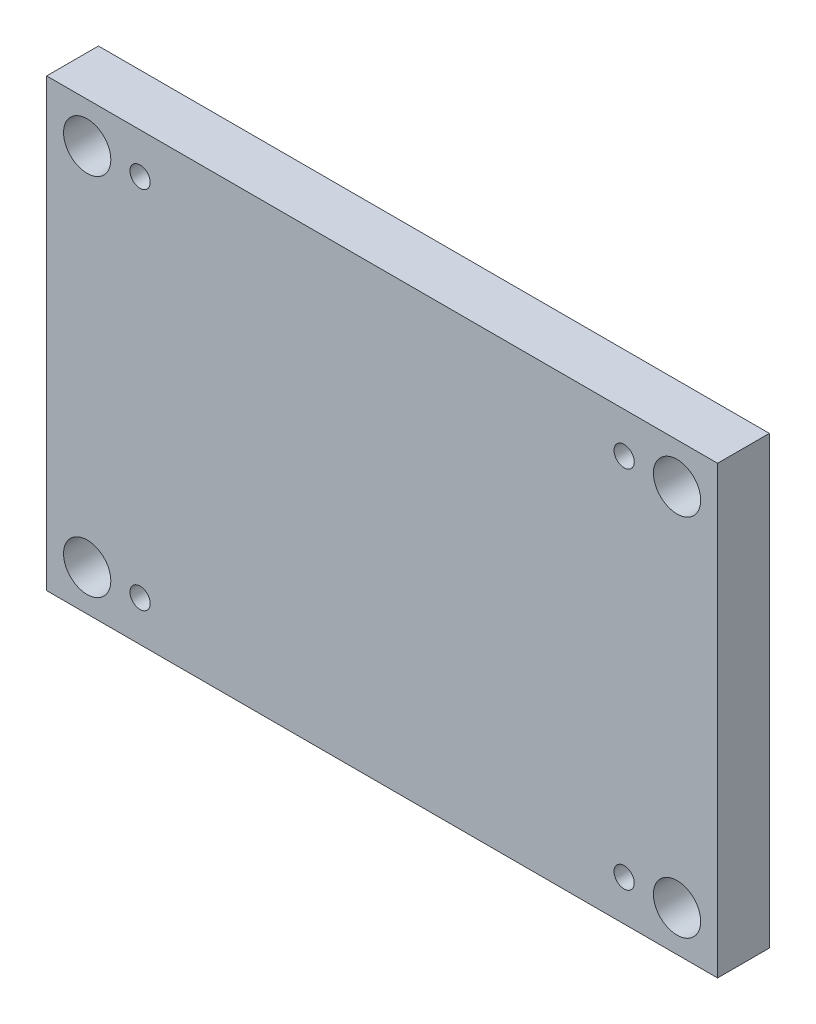
ISO-10303-21;
HEADER;
FILE_DESCRIPTION(('STEP AP214'),'2;1');
FILE_NAME('part.step','',(''),(''),'','','');
FILE_SCHEMA(('AUTOMOTIVE_DESIGN { 1 0 10303 214 1 1 1 1 }'));
ENDSEC;
DATA;
#1=APPLICATION_CONTEXT('core data for automotive mechanical design processes');
#2=APPLICATION_PROTOCOL_DEFINITION('international standard','automotive_design',2000,#1);
#3=PRODUCT_CONTEXT('',#1,'mechanical');
#4=PRODUCT('Part','Part','',(#3));
#5=PRODUCT_RELATED_PRODUCT_CATEGORY('part','',(#4));
#6=PRODUCT_DEFINITION_FORMATION('','',#4);
#7=PRODUCT_DEFINITION_CONTEXT('part definition',#1,'design');
#8=PRODUCT_DEFINITION('design','',#6,#7);
#9=PRODUCT_DEFINITION_SHAPE('','',#8);
#10=(LENGTH_UNIT() NAMED_UNIT(*) SI_UNIT(.MILLI.,.METRE.));
#11=(NAMED_UNIT(*) PLANE_ANGLE_UNIT() SI_UNIT($,.RADIAN.));
#12=(NAMED_UNIT(*) SI_UNIT($,.STERADIAN.) SOLID_ANGLE_UNIT());
#13=UNCERTAINTY_MEASURE_WITH_UNIT(LENGTH_MEASURE(1.E-05),#10,'distance_accuracy_value','');
#14=(GEOMETRIC_REPRESENTATION_CONTEXT(3) GLOBAL_UNCERTAINTY_ASSIGNED_CONTEXT((#13)) GLOBAL_UNIT_ASSIGNED_CONTEXT((#10,
#11,#12)) REPRESENTATION_CONTEXT('',''));
#15=CARTESIAN_POINT('',(0.,0.,0.));
#16=DIRECTION('',(0.,0.,1.));
#17=DIRECTION('',(1.,0.,0.));
#18=AXIS2_PLACEMENT_3D('',#15,#16,#17);
#19=CARTESIAN_POINT('',(0.,0.,46.));
#20=DIRECTION('',(0.,0.,1.));
#21=DIRECTION('',(1.,0.,0.));
#22=AXIS2_PLACEMENT_3D('',#19,#20,#21);
#23=PLANE('',#22);
#24=CARTESIAN_POINT('',(-215.,162.,46.));
#25=DIRECTION('',(0.,0.,1.));
#26=DIRECTION('',(1.,0.,0.));
#27=AXIS2_PLACEMENT_3D('',#24,#25,#26);
#28=CIRCLE('',#27,9.00000000000001);
#29=CARTESIAN_POINT('',(-206.,162.,46.));
#30=VERTEX_POINT('',#29);
#31=EDGE_CURVE('E149',#30,#30,#28,.T.);
#32=ORIENTED_EDGE('',*,*,#31,.F.);
#33=EDGE_LOOP('',(#32));
#34=FACE_BOUND('',#33,.T.);
#35=CARTESIAN_POINT('',(215.,162.,46.));
#36=DIRECTION('',(0.,0.,1.));
#37=DIRECTION('',(1.,0.,0.));
#38=AXIS2_PLACEMENT_3D('',#35,#36,#37);
#39=CIRCLE('',#38,9.00000000000001);
#40=CARTESIAN_POINT('',(224.,162.,46.));
#41=VERTEX_POINT('',#40);
#42=EDGE_CURVE('E135',#41,#41,#39,.T.);
#43=ORIENTED_EDGE('',*,*,#42,.F.);
#44=EDGE_LOOP('',(#43));
#45=FACE_BOUND('',#44,.T.);
#46=CARTESIAN_POINT('',(-262.,162.,46.));
#47=DIRECTION('',(0.,0.,1.));
#48=DIRECTION('',(1.,0.,0.));
#49=AXIS2_PLACEMENT_3D('',#46,#47,#48);
#50=CIRCLE('',#49,21.);
#51=CARTESIAN_POINT('',(-241.,162.,46.));
#52=VERTEX_POINT('',#51);
#53=EDGE_CURVE('E132',#52,#52,#50,.T.);
#54=ORIENTED_EDGE('',*,*,#53,.F.);
#55=EDGE_LOOP('',(#54));
#56=FACE_BOUND('',#55,.T.);
#57=CARTESIAN_POINT('',(-262.,-162.,46.));
#58=DIRECTION('',(0.,0.,1.));
#59=DIRECTION('',(1.,0.,0.));
#60=AXIS2_PLACEMENT_3D('',#57,#58,#59);
#61=CIRCLE('',#60,21.);
#62=CARTESIAN_POINT('',(-241.,-162.,46.));
#63=VERTEX_POINT('',#62);
#64=EDGE_CURVE('E126',#63,#63,#61,.T.);
#65=ORIENTED_EDGE('',*,*,#64,.F.);
#66=EDGE_LOOP('',(#65));
#67=FACE_BOUND('',#66,.T.);
#68=CARTESIAN_POINT('',(262.,-162.,46.));
#69=DIRECTION('',(0.,0.,1.));
#70=DIRECTION('',(1.,0.,0.));
#71=AXIS2_PLACEMENT_3D('',#68,#69,#70);
#72=CIRCLE('',#71,21.);
#73=CARTESIAN_POINT('',(283.,-162.,46.));
#74=VERTEX_POINT('',#73);
#75=EDGE_CURVE('E120',#74,#74,#72,.T.);
#76=ORIENTED_EDGE('',*,*,#75,.F.);
#77=EDGE_LOOP('',(#76));
#78=FACE_BOUND('',#77,.T.);
#79=CARTESIAN_POINT('',(262.,162.,46.));
#80=DIRECTION('',(0.,0.,1.));
#81=DIRECTION('',(1.,0.,0.));
#82=AXIS2_PLACEMENT_3D('',#79,#80,#81);
#83=CIRCLE('',#82,21.);
#84=CARTESIAN_POINT('',(283.,162.,46.));
#85=VERTEX_POINT('',#84);
#86=EDGE_CURVE('E114',#85,#85,#83,.T.);
#87=ORIENTED_EDGE('',*,*,#86,.F.);
#88=EDGE_LOOP('',(#87));
#89=FACE_BOUND('',#88,.T.);
#90=DIRECTION('',(0.,-1.,0.));
#91=VECTOR('',#90,1.);
#92=CARTESIAN_POINT('',(-298.,198.,46.));
#93=LINE('',#92,#91);
#94=CARTESIAN_POINT('',(-298.,198.,46.));
#95=VERTEX_POINT('',#94);
#96=CARTESIAN_POINT('',(-298.,-198.,46.));
#97=VERTEX_POINT('',#96);
#98=EDGE_CURVE('E87',#95,#97,#93,.T.);
#99=ORIENTED_EDGE('',*,*,#98,.T.);
#100=DIRECTION('',(1.,0.,0.));
#101=VECTOR('',#100,1.);
#102=CARTESIAN_POINT('',(-298.,-198.,46.));
#103=LINE('',#102,#101);
#104=CARTESIAN_POINT('',(298.,-198.,46.));
#105=VERTEX_POINT('',#104);
#106=EDGE_CURVE('E82',#97,#105,#103,.T.);
#107=ORIENTED_EDGE('',*,*,#106,.T.);
#108=DIRECTION('',(0.,1.,0.));
#109=VECTOR('',#108,1.);
#110=CARTESIAN_POINT('',(298.,-198.,46.));
#111=LINE('',#110,#109);
#112=CARTESIAN_POINT('',(298.,198.,46.));
#113=VERTEX_POINT('',#112);
#114=EDGE_CURVE('E85',#105,#113,#111,.T.);
#115=ORIENTED_EDGE('',*,*,#114,.T.);
#116=DIRECTION('',(-1.,0.,0.));
#117=VECTOR('',#116,1.);
#118=CARTESIAN_POINT('',(298.,198.,46.));
#119=LINE('',#118,#117);
#120=EDGE_CURVE('E52',#113,#95,#119,.T.);
#121=ORIENTED_EDGE('',*,*,#120,.T.);
#122=EDGE_LOOP('',(#99,#107,#115,#121));
#123=FACE_BOUND('',#122,.T.);
#124=CARTESIAN_POINT('',(215.,-162.,46.));
#125=DIRECTION('',(0.,0.,-1.));
#126=DIRECTION('',(-1.,0.,0.));
#127=AXIS2_PLACEMENT_3D('',#124,#125,#126);
#128=CIRCLE('',#127,9.00000000000001);
#129=CARTESIAN_POINT('',(206.,-162.,46.));
#130=VERTEX_POINT('',#129);
#131=EDGE_CURVE('E146',#130,#130,#128,.T.);
#132=ORIENTED_EDGE('',*,*,#131,.T.);
#133=EDGE_LOOP('',(#132));
#134=FACE_BOUND('',#133,.T.);
#135=CARTESIAN_POINT('',(-215.,-162.,46.));
#136=DIRECTION('',(0.,0.,-1.));
#137=DIRECTION('',(-1.,0.,0.));
#138=AXIS2_PLACEMENT_3D('',#135,#136,#137);
#139=CIRCLE('',#138,9.00000000000001);
#140=CARTESIAN_POINT('',(-224.,-162.,46.));
#141=VERTEX_POINT('',#140);
#142=EDGE_CURVE('E158',#141,#141,#139,.T.);
#143=ORIENTED_EDGE('',*,*,#142,.T.);
#144=EDGE_LOOP('',(#143));
#145=FACE_BOUND('',#144,.T.);
#146=ADVANCED_FACE('F35',(#34,#45,#56,#67,#78,#89,#123,#134,#145),#23,.T.);
#147=CARTESIAN_POINT('',(0.,0.,0.));
#148=DIRECTION('',(0.,0.,1.));
#149=DIRECTION('',(1.,0.,0.));
#150=AXIS2_PLACEMENT_3D('',#147,#148,#149);
#151=PLANE('',#150);
#152=CARTESIAN_POINT('',(-215.,162.,0.));
#153=DIRECTION('',(0.,0.,1.));
#154=DIRECTION('',(1.,0.,0.));
#155=AXIS2_PLACEMENT_3D('',#152,#153,#154);
#156=CIRCLE('',#155,9.00000000000001);
#157=CARTESIAN_POINT('',(-206.,162.,0.));
#158=VERTEX_POINT('',#157);
#159=EDGE_CURVE('E152',#158,#158,#156,.T.);
#160=ORIENTED_EDGE('',*,*,#159,.T.);
#161=EDGE_LOOP('',(#160));
#162=FACE_BOUND('',#161,.T.);
#163=CARTESIAN_POINT('',(215.,162.,0.));
#164=DIRECTION('',(0.,0.,1.));
#165=DIRECTION('',(1.,0.,0.));
#166=AXIS2_PLACEMENT_3D('',#163,#164,#165);
#167=CIRCLE('',#166,9.00000000000001);
#168=CARTESIAN_POINT('',(224.,162.,0.));
#169=VERTEX_POINT('',#168);
#170=EDGE_CURVE('E140',#169,#169,#167,.T.);
#171=ORIENTED_EDGE('',*,*,#170,.T.);
#172=EDGE_LOOP('',(#171));
#173=FACE_BOUND('',#172,.T.);
#174=CARTESIAN_POINT('',(-262.,162.,0.));
#175=DIRECTION('',(0.,0.,1.));
#176=DIRECTION('',(1.,0.,0.));
#177=AXIS2_PLACEMENT_3D('',#174,#175,#176);
#178=CIRCLE('',#177,21.);
#179=CARTESIAN_POINT('',(-241.,162.,0.));
#180=VERTEX_POINT('',#179);
#181=EDGE_CURVE('E129',#180,#180,#178,.T.);
#182=ORIENTED_EDGE('',*,*,#181,.T.);
#183=EDGE_LOOP('',(#182));
#184=FACE_BOUND('',#183,.T.);
#185=CARTESIAN_POINT('',(-262.,-162.,0.));
#186=DIRECTION('',(0.,0.,1.));
#187=DIRECTION('',(1.,0.,0.));
#188=AXIS2_PLACEMENT_3D('',#185,#186,#187);
#189=CIRCLE('',#188,21.);
#190=CARTESIAN_POINT('',(-241.,-162.,0.));
#191=VERTEX_POINT('',#190);
#192=EDGE_CURVE('E123',#191,#191,#189,.T.);
#193=ORIENTED_EDGE('',*,*,#192,.T.);
#194=EDGE_LOOP('',(#193));
#195=FACE_BOUND('',#194,.T.);
#196=CARTESIAN_POINT('',(262.,-162.,0.));
#197=DIRECTION('',(0.,0.,1.));
#198=DIRECTION('',(1.,0.,0.));
#199=AXIS2_PLACEMENT_3D('',#196,#197,#198);
#200=CIRCLE('',#199,21.);
#201=CARTESIAN_POINT('',(283.,-162.,0.));
#202=VERTEX_POINT('',#201);
#203=EDGE_CURVE('E117',#202,#202,#200,.T.);
#204=ORIENTED_EDGE('',*,*,#203,.T.);
#205=EDGE_LOOP('',(#204));
#206=FACE_BOUND('',#205,.T.);
#207=CARTESIAN_POINT('',(262.,162.,0.));
#208=DIRECTION('',(0.,0.,1.));
#209=DIRECTION('',(1.,0.,0.));
#210=AXIS2_PLACEMENT_3D('',#207,#208,#209);
#211=CIRCLE('',#210,21.);
#212=CARTESIAN_POINT('',(283.,162.,0.));
#213=VERTEX_POINT('',#212);
#214=EDGE_CURVE('E102',#213,#213,#211,.T.);
#215=ORIENTED_EDGE('',*,*,#214,.T.);
#216=EDGE_LOOP('',(#215));
#217=FACE_BOUND('',#216,.T.);
#218=DIRECTION('',(0.,-1.,0.));
#219=VECTOR('',#218,1.);
#220=CARTESIAN_POINT('',(-298.,198.,0.));
#221=LINE('',#220,#219);
#222=CARTESIAN_POINT('',(-298.,198.,0.));
#223=VERTEX_POINT('',#222);
#224=CARTESIAN_POINT('',(-298.,-198.,0.));
#225=VERTEX_POINT('',#224);
#226=EDGE_CURVE('E99',#223,#225,#221,.T.);
#227=ORIENTED_EDGE('',*,*,#226,.F.);
#228=DIRECTION('',(-1.,0.,0.));
#229=VECTOR('',#228,1.);
#230=CARTESIAN_POINT('',(298.,198.,0.));
#231=LINE('',#230,#229);
#232=CARTESIAN_POINT('',(298.,198.,0.));
#233=VERTEX_POINT('',#232);
#234=EDGE_CURVE('E75',#233,#223,#231,.T.);
#235=ORIENTED_EDGE('',*,*,#234,.F.);
#236=DIRECTION('',(0.,1.,0.));
#237=VECTOR('',#236,1.);
#238=CARTESIAN_POINT('',(298.,-198.,0.));
#239=LINE('',#238,#237);
#240=CARTESIAN_POINT('',(298.,-198.,0.));
#241=VERTEX_POINT('',#240);
#242=EDGE_CURVE('E69',#241,#233,#239,.T.);
#243=ORIENTED_EDGE('',*,*,#242,.F.);
#244=DIRECTION('',(1.,0.,0.));
#245=VECTOR('',#244,1.);
#246=CARTESIAN_POINT('',(-298.,-198.,0.));
#247=LINE('',#246,#245);
#248=EDGE_CURVE('E91',#225,#241,#247,.T.);
#249=ORIENTED_EDGE('',*,*,#248,.F.);
#250=EDGE_LOOP('',(#227,#235,#243,#249));
#251=FACE_BOUND('',#250,.T.);
#252=CARTESIAN_POINT('',(215.,-162.,0.));
#253=DIRECTION('',(0.,0.,-1.));
#254=DIRECTION('',(-1.,0.,0.));
#255=AXIS2_PLACEMENT_3D('',#252,#253,#254);
#256=CIRCLE('',#255,9.00000000000001);
#257=CARTESIAN_POINT('',(206.,-162.,0.));
#258=VERTEX_POINT('',#257);
#259=EDGE_CURVE('E143',#258,#258,#256,.T.);
#260=ORIENTED_EDGE('',*,*,#259,.F.);
#261=EDGE_LOOP('',(#260));
#262=FACE_BOUND('',#261,.T.);
#263=CARTESIAN_POINT('',(-215.,-162.,0.));
#264=DIRECTION('',(0.,0.,-1.));
#265=DIRECTION('',(-1.,0.,0.));
#266=AXIS2_PLACEMENT_3D('',#263,#264,#265);
#267=CIRCLE('',#266,9.00000000000001);
#268=CARTESIAN_POINT('',(-224.,-162.,0.));
#269=VERTEX_POINT('',#268);
#270=EDGE_CURVE('E155',#269,#269,#267,.T.);
#271=ORIENTED_EDGE('',*,*,#270,.F.);
#272=EDGE_LOOP('',(#271));
#273=FACE_BOUND('',#272,.T.);
#274=ADVANCED_FACE('F110',(#162,#173,#184,#195,#206,#217,#251,#262,#273),#151,.F.);
#275=CARTESIAN_POINT('',(-298.,198.,46.));
#276=DIRECTION('',(1.,0.,0.));
#277=DIRECTION('',(0.,0.,-1.));
#278=AXIS2_PLACEMENT_3D('',#275,#276,#277);
#279=PLANE('',#278);
#280=ORIENTED_EDGE('',*,*,#226,.T.);
#281=DIRECTION('',(0.,0.,-1.));
#282=VECTOR('',#281,1.);
#283=CARTESIAN_POINT('',(-298.,-198.,46.));
#284=LINE('',#283,#282);
#285=EDGE_CURVE('E11',#97,#225,#284,.T.);
#286=ORIENTED_EDGE('',*,*,#285,.F.);
#287=ORIENTED_EDGE('',*,*,#98,.F.);
#288=DIRECTION('',(0.,0.,-1.));
#289=VECTOR('',#288,1.);
#290=CARTESIAN_POINT('',(-298.,198.,46.));
#291=LINE('',#290,#289);
#292=EDGE_CURVE('E95',#95,#223,#291,.T.);
#293=ORIENTED_EDGE('',*,*,#292,.T.);
#294=EDGE_LOOP('',(#280,#286,#287,#293));
#295=FACE_BOUND('',#294,.T.);
#296=ADVANCED_FACE('F37',(#295),#279,.F.);
#297=CARTESIAN_POINT('',(-298.,-198.,46.));
#298=DIRECTION('',(0.,1.,0.));
#299=DIRECTION('',(0.,0.,1.));
#300=AXIS2_PLACEMENT_3D('',#297,#298,#299);
#301=PLANE('',#300);
#302=ORIENTED_EDGE('',*,*,#248,.T.);
#303=DIRECTION('',(0.,0.,-1.));
#304=VECTOR('',#303,1.);
#305=CARTESIAN_POINT('',(298.,-198.,46.));
#306=LINE('',#305,#304);
#307=EDGE_CURVE('E44',#105,#241,#306,.T.);
#308=ORIENTED_EDGE('',*,*,#307,.F.);
#309=ORIENTED_EDGE('',*,*,#106,.F.);
#310=ORIENTED_EDGE('',*,*,#285,.T.);
#311=EDGE_LOOP('',(#302,#308,#309,#310));
#312=FACE_BOUND('',#311,.T.);
#313=ADVANCED_FACE('F90',(#312),#301,.F.);
#314=CARTESIAN_POINT('',(298.,-198.,46.));
#315=DIRECTION('',(-1.,0.,0.));
#316=DIRECTION('',(0.,0.,1.));
#317=AXIS2_PLACEMENT_3D('',#314,#315,#316);
#318=PLANE('',#317);
#319=ORIENTED_EDGE('',*,*,#242,.T.);
#320=DIRECTION('',(0.,0.,-1.));
#321=VECTOR('',#320,1.);
#322=CARTESIAN_POINT('',(298.,198.,46.));
#323=LINE('',#322,#321);
#324=EDGE_CURVE('E92',#113,#233,#323,.T.);
#325=ORIENTED_EDGE('',*,*,#324,.F.);
#326=ORIENTED_EDGE('',*,*,#114,.F.);
#327=ORIENTED_EDGE('',*,*,#307,.T.);
#328=EDGE_LOOP('',(#319,#325,#326,#327));
#329=FACE_BOUND('',#328,.T.);
#330=ADVANCED_FACE('F93',(#329),#318,.F.);
#331=CARTESIAN_POINT('',(298.,198.,46.));
#332=DIRECTION('',(0.,-1.,0.));
#333=DIRECTION('',(0.,0.,-1.));
#334=AXIS2_PLACEMENT_3D('',#331,#332,#333);
#335=PLANE('',#334);
#336=ORIENTED_EDGE('',*,*,#234,.T.);
#337=ORIENTED_EDGE('',*,*,#292,.F.);
#338=ORIENTED_EDGE('',*,*,#120,.F.);
#339=ORIENTED_EDGE('',*,*,#324,.T.);
#340=EDGE_LOOP('',(#336,#337,#338,#339));
#341=FACE_BOUND('',#340,.T.);
#342=ADVANCED_FACE('F107',(#341),#335,.F.);
#343=CARTESIAN_POINT('',(262.,162.,0.));
#344=DIRECTION('',(0.,0.,1.));
#345=DIRECTION('',(1.,0.,0.));
#346=AXIS2_PLACEMENT_3D('',#343,#344,#345);
#347=CYLINDRICAL_SURFACE('',#346,21.);
#348=ORIENTED_EDGE('',*,*,#214,.F.);
#349=EDGE_LOOP('',(#348));
#350=FACE_BOUND('',#349,.T.);
#351=ORIENTED_EDGE('',*,*,#86,.T.);
#352=EDGE_LOOP('',(#351));
#353=FACE_BOUND('',#352,.T.);
#354=ADVANCED_FACE('F185',(#350,#353),#347,.F.);
#355=CARTESIAN_POINT('',(262.,-162.,0.));
#356=DIRECTION('',(0.,0.,1.));
#357=DIRECTION('',(1.,0.,0.));
#358=AXIS2_PLACEMENT_3D('',#355,#356,#357);
#359=CYLINDRICAL_SURFACE('',#358,21.);
#360=ORIENTED_EDGE('',*,*,#203,.F.);
#361=EDGE_LOOP('',(#360));
#362=FACE_BOUND('',#361,.T.);
#363=ORIENTED_EDGE('',*,*,#75,.T.);
#364=EDGE_LOOP('',(#363));
#365=FACE_BOUND('',#364,.T.);
#366=ADVANCED_FACE('F261',(#362,#365),#359,.F.);
#367=CARTESIAN_POINT('',(-262.,-162.,0.));
#368=DIRECTION('',(0.,0.,1.));
#369=DIRECTION('',(1.,0.,0.));
#370=AXIS2_PLACEMENT_3D('',#367,#368,#369);
#371=CYLINDRICAL_SURFACE('',#370,21.);
#372=ORIENTED_EDGE('',*,*,#192,.F.);
#373=EDGE_LOOP('',(#372));
#374=FACE_BOUND('',#373,.T.);
#375=ORIENTED_EDGE('',*,*,#64,.T.);
#376=EDGE_LOOP('',(#375));
#377=FACE_BOUND('',#376,.T.);
#378=ADVANCED_FACE('F251',(#374,#377),#371,.F.);
#379=CARTESIAN_POINT('',(-262.,162.,0.));
#380=DIRECTION('',(0.,0.,1.));
#381=DIRECTION('',(1.,0.,0.));
#382=AXIS2_PLACEMENT_3D('',#379,#380,#381);
#383=CYLINDRICAL_SURFACE('',#382,21.);
#384=ORIENTED_EDGE('',*,*,#181,.F.);
#385=EDGE_LOOP('',(#384));
#386=FACE_BOUND('',#385,.T.);
#387=ORIENTED_EDGE('',*,*,#53,.T.);
#388=EDGE_LOOP('',(#387));
#389=FACE_BOUND('',#388,.T.);
#390=ADVANCED_FACE('F241',(#386,#389),#383,.F.);
#391=CARTESIAN_POINT('',(215.,162.,0.));
#392=DIRECTION('',(0.,0.,1.));
#393=DIRECTION('',(1.,0.,0.));
#394=AXIS2_PLACEMENT_3D('',#391,#392,#393);
#395=CYLINDRICAL_SURFACE('',#394,9.00000000000001);
#396=ORIENTED_EDGE('',*,*,#42,.T.);
#397=EDGE_LOOP('',(#396));
#398=FACE_BOUND('',#397,.T.);
#399=ORIENTED_EDGE('',*,*,#170,.F.);
#400=EDGE_LOOP('',(#399));
#401=FACE_BOUND('',#400,.T.);
#402=ADVANCED_FACE('F231',(#398,#401),#395,.F.);
#403=CARTESIAN_POINT('',(215.,-162.,46.));
#404=DIRECTION('',(0.,0.,-1.));
#405=DIRECTION('',(-1.,0.,0.));
#406=AXIS2_PLACEMENT_3D('',#403,#404,#405);
#407=CYLINDRICAL_SURFACE('',#406,9.00000000000001);
#408=ORIENTED_EDGE('',*,*,#259,.T.);
#409=EDGE_LOOP('',(#408));
#410=FACE_BOUND('',#409,.T.);
#411=ORIENTED_EDGE('',*,*,#131,.F.);
#412=EDGE_LOOP('',(#411));
#413=FACE_BOUND('',#412,.T.);
#414=ADVANCED_FACE('F171',(#410,#413),#407,.F.);
#415=CARTESIAN_POINT('',(-215.,162.,0.));
#416=DIRECTION('',(0.,0.,1.));
#417=DIRECTION('',(1.,0.,0.));
#418=AXIS2_PLACEMENT_3D('',#415,#416,#417);
#419=CYLINDRICAL_SURFACE('',#418,9.00000000000001);
#420=ORIENTED_EDGE('',*,*,#31,.T.);
#421=EDGE_LOOP('',(#420));
#422=FACE_BOUND('',#421,.T.);
#423=ORIENTED_EDGE('',*,*,#159,.F.);
#424=EDGE_LOOP('',(#423));
#425=FACE_BOUND('',#424,.T.);
#426=ADVANCED_FACE('F165',(#422,#425),#419,.F.);
#427=CARTESIAN_POINT('',(-215.,-162.,46.));
#428=DIRECTION('',(0.,0.,-1.));
#429=DIRECTION('',(-1.,0.,0.));
#430=AXIS2_PLACEMENT_3D('',#427,#428,#429);
#431=CYLINDRICAL_SURFACE('',#430,9.00000000000001);
#432=ORIENTED_EDGE('',*,*,#270,.T.);
#433=EDGE_LOOP('',(#432));
#434=FACE_BOUND('',#433,.T.);
#435=ORIENTED_EDGE('',*,*,#142,.F.);
#436=EDGE_LOOP('',(#435));
#437=FACE_BOUND('',#436,.T.);
#438=ADVANCED_FACE('F163',(#434,#437),#431,.F.);
#439=CLOSED_SHELL('',(#146,#274,#296,#313,#330,#342,#354,#366,#378,#390,#402,#414,#426,#438));
#440=MANIFOLD_SOLID_BREP('B2',#439);
#441=ADVANCED_BREP_SHAPE_REPRESENTATION('',(#18,#440),#14);
#442=SHAPE_DEFINITION_REPRESENTATION(#9,#441);
ENDSEC;
END-ISO-10303-21;
